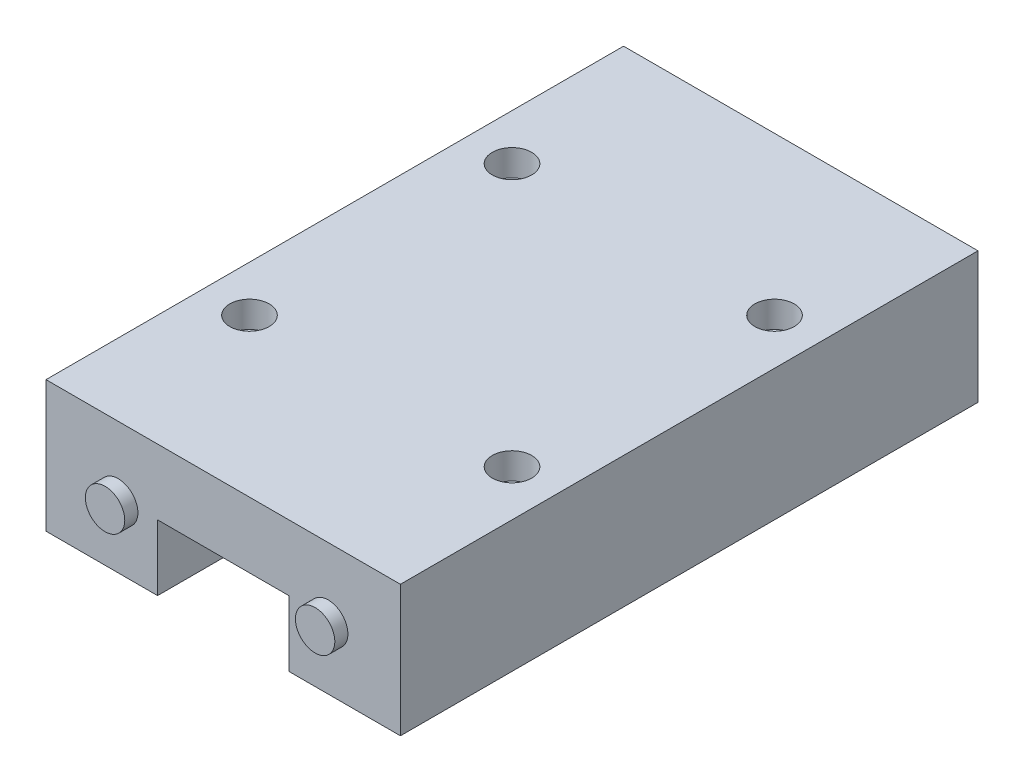
ISO-10303-21;
HEADER;
FILE_DESCRIPTION(('STEP AP214'),'2;1');
FILE_NAME('part.step','',(''),(''),'','','');
FILE_SCHEMA(('AUTOMOTIVE_DESIGN { 1 0 10303 214 1 1 1 1 }'));
ENDSEC;
DATA;
#1=APPLICATION_CONTEXT('core data for automotive mechanical design processes');
#2=APPLICATION_PROTOCOL_DEFINITION('international standard','automotive_design',2000,#1);
#3=PRODUCT_CONTEXT('',#1,'mechanical');
#4=PRODUCT('Part','Part','',(#3));
#5=PRODUCT_RELATED_PRODUCT_CATEGORY('part','',(#4));
#6=PRODUCT_DEFINITION_FORMATION('','',#4);
#7=PRODUCT_DEFINITION_CONTEXT('part definition',#1,'design');
#8=PRODUCT_DEFINITION('design','',#6,#7);
#9=PRODUCT_DEFINITION_SHAPE('','',#8);
#10=(LENGTH_UNIT() NAMED_UNIT(*) SI_UNIT(.MILLI.,.METRE.));
#11=(NAMED_UNIT(*) PLANE_ANGLE_UNIT() SI_UNIT($,.RADIAN.));
#12=(NAMED_UNIT(*) SI_UNIT($,.STERADIAN.) SOLID_ANGLE_UNIT());
#13=UNCERTAINTY_MEASURE_WITH_UNIT(LENGTH_MEASURE(1.E-05),#10,'distance_accuracy_value','');
#14=(GEOMETRIC_REPRESENTATION_CONTEXT(3) GLOBAL_UNCERTAINTY_ASSIGNED_CONTEXT((#13)) GLOBAL_UNIT_ASSIGNED_CONTEXT((#10,
#11,#12)) REPRESENTATION_CONTEXT('',''));
#15=CARTESIAN_POINT('',(0.,0.,0.));
#16=DIRECTION('',(0.,0.,1.));
#17=DIRECTION('',(1.,0.,0.));
#18=AXIS2_PLACEMENT_3D('',#15,#16,#17);
#19=CARTESIAN_POINT('',(-13.5,5.,44.));
#20=DIRECTION('',(1.,0.,0.));
#21=DIRECTION('',(0.,0.,-1.));
#22=AXIS2_PLACEMENT_3D('',#19,#20,#21);
#23=PLANE('',#22);
#24=DIRECTION('',(0.,-1.,0.));
#25=VECTOR('',#24,1.);
#26=CARTESIAN_POINT('',(-13.5,5.,0.));
#27=LINE('',#26,#25);
#28=CARTESIAN_POINT('',(-13.5,5.,0.));
#29=VERTEX_POINT('',#28);
#30=CARTESIAN_POINT('',(-13.5,-5.,0.));
#31=VERTEX_POINT('',#30);
#32=EDGE_CURVE('E130',#29,#31,#27,.T.);
#33=ORIENTED_EDGE('',*,*,#32,.T.);
#34=DIRECTION('',(0.,0.,-1.));
#35=VECTOR('',#34,1.);
#36=CARTESIAN_POINT('',(-13.5,-5.,44.));
#37=LINE('',#36,#35);
#38=CARTESIAN_POINT('',(-13.5,-5.,44.));
#39=VERTEX_POINT('',#38);
#40=EDGE_CURVE('E158',#39,#31,#37,.T.);
#41=ORIENTED_EDGE('',*,*,#40,.F.);
#42=DIRECTION('',(0.,-1.,0.));
#43=VECTOR('',#42,1.);
#44=CARTESIAN_POINT('',(-13.5,5.,44.));
#45=LINE('',#44,#43);
#46=CARTESIAN_POINT('',(-13.5,5.,44.));
#47=VERTEX_POINT('',#46);
#48=EDGE_CURVE('E145',#47,#39,#45,.T.);
#49=ORIENTED_EDGE('',*,*,#48,.F.);
#50=DIRECTION('',(0.,0.,-1.));
#51=VECTOR('',#50,1.);
#52=CARTESIAN_POINT('',(-13.5,5.,44.));
#53=LINE('',#52,#51);
#54=EDGE_CURVE('E126',#47,#29,#53,.T.);
#55=ORIENTED_EDGE('',*,*,#54,.T.);
#56=EDGE_LOOP('',(#33,#41,#49,#55));
#57=FACE_BOUND('',#56,.T.);
#58=ADVANCED_FACE('F33',(#57),#23,.F.);
#59=CARTESIAN_POINT('',(-13.5,-5.,44.));
#60=DIRECTION('',(0.,1.,0.));
#61=DIRECTION('',(0.,0.,1.));
#62=AXIS2_PLACEMENT_3D('',#59,#60,#61);
#63=PLANE('',#62);
#64=DIRECTION('',(1.,0.,0.));
#65=VECTOR('',#64,1.);
#66=CARTESIAN_POINT('',(-13.5,-5.,0.));
#67=LINE('',#66,#65);
#68=CARTESIAN_POINT('',(-5.,-5.,0.));
#69=VERTEX_POINT('',#68);
#70=EDGE_CURVE('E133',#31,#69,#67,.T.);
#71=ORIENTED_EDGE('',*,*,#70,.T.);
#72=DIRECTION('',(0.,0.,-1.));
#73=VECTOR('',#72,1.);
#74=CARTESIAN_POINT('',(-5.,-5.,44.));
#75=LINE('',#74,#73);
#76=CARTESIAN_POINT('',(-5.,-5.,44.));
#77=VERTEX_POINT('',#76);
#78=EDGE_CURVE('E155',#77,#69,#75,.T.);
#79=ORIENTED_EDGE('',*,*,#78,.F.);
#80=DIRECTION('',(1.,0.,0.));
#81=VECTOR('',#80,1.);
#82=CARTESIAN_POINT('',(-13.5,-5.,44.));
#83=LINE('',#82,#81);
#84=EDGE_CURVE('E93',#39,#77,#83,.T.);
#85=ORIENTED_EDGE('',*,*,#84,.F.);
#86=ORIENTED_EDGE('',*,*,#40,.T.);
#87=EDGE_LOOP('',(#71,#79,#85,#86));
#88=FACE_BOUND('',#87,.T.);
#89=ADVANCED_FACE('F190',(#88),#63,.F.);
#90=CARTESIAN_POINT('',(-5.,-5.,44.));
#91=DIRECTION('',(-1.,0.,0.));
#92=DIRECTION('',(0.,0.,1.));
#93=AXIS2_PLACEMENT_3D('',#90,#91,#92);
#94=PLANE('',#93);
#95=DIRECTION('',(0.,1.,0.));
#96=VECTOR('',#95,1.);
#97=CARTESIAN_POINT('',(-5.,-5.,0.));
#98=LINE('',#97,#96);
#99=CARTESIAN_POINT('',(-5.,0.,0.));
#100=VERTEX_POINT('',#99);
#101=EDGE_CURVE('E136',#69,#100,#98,.T.);
#102=ORIENTED_EDGE('',*,*,#101,.T.);
#103=DIRECTION('',(0.,0.,-1.));
#104=VECTOR('',#103,1.);
#105=CARTESIAN_POINT('',(-5.,0.,44.));
#106=LINE('',#105,#104);
#107=CARTESIAN_POINT('',(-5.,0.,44.));
#108=VERTEX_POINT('',#107);
#109=EDGE_CURVE('E152',#108,#100,#106,.T.);
#110=ORIENTED_EDGE('',*,*,#109,.F.);
#111=DIRECTION('',(0.,1.,0.));
#112=VECTOR('',#111,1.);
#113=CARTESIAN_POINT('',(-5.,-5.,44.));
#114=LINE('',#113,#112);
#115=EDGE_CURVE('E436',#77,#108,#114,.T.);
#116=ORIENTED_EDGE('',*,*,#115,.F.);
#117=ORIENTED_EDGE('',*,*,#78,.T.);
#118=EDGE_LOOP('',(#102,#110,#116,#117));
#119=FACE_BOUND('',#118,.T.);
#120=ADVANCED_FACE('F194',(#119),#94,.F.);
#121=CARTESIAN_POINT('',(-5.,0.,44.));
#122=DIRECTION('',(0.,1.,0.));
#123=DIRECTION('',(0.,0.,1.));
#124=AXIS2_PLACEMENT_3D('',#121,#122,#123);
#125=PLANE('',#124);
#126=DIRECTION('',(1.,0.,0.));
#127=VECTOR('',#126,1.);
#128=CARTESIAN_POINT('',(-5.,0.,0.));
#129=LINE('',#128,#127);
#130=CARTESIAN_POINT('',(5.,0.,0.));
#131=VERTEX_POINT('',#130);
#132=EDGE_CURVE('E138',#100,#131,#129,.T.);
#133=ORIENTED_EDGE('',*,*,#132,.T.);
#134=DIRECTION('',(0.,0.,-1.));
#135=VECTOR('',#134,1.);
#136=CARTESIAN_POINT('',(5.,0.,44.));
#137=LINE('',#136,#135);
#138=CARTESIAN_POINT('',(5.,0.,44.));
#139=VERTEX_POINT('',#138);
#140=EDGE_CURVE('E149',#139,#131,#137,.T.);
#141=ORIENTED_EDGE('',*,*,#140,.F.);
#142=DIRECTION('',(1.,0.,0.));
#143=VECTOR('',#142,1.);
#144=CARTESIAN_POINT('',(-5.,0.,44.));
#145=LINE('',#144,#143);
#146=EDGE_CURVE('E438',#108,#139,#145,.T.);
#147=ORIENTED_EDGE('',*,*,#146,.F.);
#148=ORIENTED_EDGE('',*,*,#109,.T.);
#149=EDGE_LOOP('',(#133,#141,#147,#148));
#150=FACE_BOUND('',#149,.T.);
#151=ADVANCED_FACE('F198',(#150),#125,.F.);
#152=CARTESIAN_POINT('',(5.,-5.,44.));
#153=DIRECTION('',(1.,0.,0.));
#154=DIRECTION('',(0.,0.,-1.));
#155=AXIS2_PLACEMENT_3D('',#152,#153,#154);
#156=PLANE('',#155);
#157=DIRECTION('',(0.,-1.,0.));
#158=VECTOR('',#157,1.);
#159=CARTESIAN_POINT('',(5.,-5.,0.));
#160=LINE('',#159,#158);
#161=CARTESIAN_POINT('',(5.,-5.,0.));
#162=VERTEX_POINT('',#161);
#163=EDGE_CURVE('E140',#131,#162,#160,.T.);
#164=ORIENTED_EDGE('',*,*,#163,.T.);
#165=DIRECTION('',(0.,0.,-1.));
#166=VECTOR('',#165,1.);
#167=CARTESIAN_POINT('',(5.,-5.,44.));
#168=LINE('',#167,#166);
#169=CARTESIAN_POINT('',(5.,-5.,44.));
#170=VERTEX_POINT('',#169);
#171=EDGE_CURVE('E121',#170,#162,#168,.T.);
#172=ORIENTED_EDGE('',*,*,#171,.F.);
#173=DIRECTION('',(0.,-1.,0.));
#174=VECTOR('',#173,1.);
#175=CARTESIAN_POINT('',(5.,-5.,44.));
#176=LINE('',#175,#174);
#177=EDGE_CURVE('E112',#139,#170,#176,.T.);
#178=ORIENTED_EDGE('',*,*,#177,.F.);
#179=ORIENTED_EDGE('',*,*,#140,.T.);
#180=EDGE_LOOP('',(#164,#172,#178,#179));
#181=FACE_BOUND('',#180,.T.);
#182=ADVANCED_FACE('F204',(#181),#156,.F.);
#183=CARTESIAN_POINT('',(5.,-5.,44.));
#184=DIRECTION('',(0.,1.,0.));
#185=DIRECTION('',(-1.,0.,0.));
#186=AXIS2_PLACEMENT_3D('',#183,#184,#185);
#187=PLANE('',#186);
#188=DIRECTION('',(1.,0.,0.));
#189=VECTOR('',#188,1.);
#190=CARTESIAN_POINT('',(5.,-5.,0.));
#191=LINE('',#190,#189);
#192=CARTESIAN_POINT('',(13.5,-5.,0.));
#193=VERTEX_POINT('',#192);
#194=EDGE_CURVE('E120',#162,#193,#191,.T.);
#195=ORIENTED_EDGE('',*,*,#194,.T.);
#196=DIRECTION('',(0.,0.,-1.));
#197=VECTOR('',#196,1.);
#198=CARTESIAN_POINT('',(13.5,-5.,44.));
#199=LINE('',#198,#197);
#200=CARTESIAN_POINT('',(13.5,-5.,44.));
#201=VERTEX_POINT('',#200);
#202=EDGE_CURVE('E117',#201,#193,#199,.T.);
#203=ORIENTED_EDGE('',*,*,#202,.F.);
#204=DIRECTION('',(1.,0.,0.));
#205=VECTOR('',#204,1.);
#206=CARTESIAN_POINT('',(5.,-5.,44.));
#207=LINE('',#206,#205);
#208=EDGE_CURVE('E106',#170,#201,#207,.T.);
#209=ORIENTED_EDGE('',*,*,#208,.F.);
#210=ORIENTED_EDGE('',*,*,#171,.T.);
#211=EDGE_LOOP('',(#195,#203,#209,#210));
#212=FACE_BOUND('',#211,.T.);
#213=ADVANCED_FACE('F118',(#212),#187,.F.);
#214=CARTESIAN_POINT('',(13.5,5.,44.));
#215=DIRECTION('',(-1.,0.,0.));
#216=DIRECTION('',(0.,0.,1.));
#217=AXIS2_PLACEMENT_3D('',#214,#215,#216);
#218=PLANE('',#217);
#219=DIRECTION('',(0.,1.,0.));
#220=VECTOR('',#219,1.);
#221=CARTESIAN_POINT('',(13.5,5.,0.));
#222=LINE('',#221,#220);
#223=CARTESIAN_POINT('',(13.5,5.,0.));
#224=VERTEX_POINT('',#223);
#225=EDGE_CURVE('E78',#193,#224,#222,.T.);
#226=ORIENTED_EDGE('',*,*,#225,.T.);
#227=DIRECTION('',(0.,0.,-1.));
#228=VECTOR('',#227,1.);
#229=CARTESIAN_POINT('',(13.5,5.,44.));
#230=LINE('',#229,#228);
#231=CARTESIAN_POINT('',(13.5,5.,44.));
#232=VERTEX_POINT('',#231);
#233=EDGE_CURVE('E122',#232,#224,#230,.T.);
#234=ORIENTED_EDGE('',*,*,#233,.F.);
#235=DIRECTION('',(0.,1.,0.));
#236=VECTOR('',#235,1.);
#237=CARTESIAN_POINT('',(13.5,5.,44.));
#238=LINE('',#237,#236);
#239=EDGE_CURVE('E110',#201,#232,#238,.T.);
#240=ORIENTED_EDGE('',*,*,#239,.F.);
#241=ORIENTED_EDGE('',*,*,#202,.T.);
#242=EDGE_LOOP('',(#226,#234,#240,#241));
#243=FACE_BOUND('',#242,.T.);
#244=ADVANCED_FACE('F124',(#243),#218,.F.);
#245=CARTESIAN_POINT('',(-13.5,5.,44.));
#246=DIRECTION('',(0.,-1.,0.));
#247=DIRECTION('',(0.,0.,-1.));
#248=AXIS2_PLACEMENT_3D('',#245,#246,#247);
#249=PLANE('',#248);
#250=CARTESIAN_POINT('',(10.,5.,32.));
#251=DIRECTION('',(0.,1.,0.));
#252=DIRECTION('',(0.,0.,-1.));
#253=AXIS2_PLACEMENT_3D('',#250,#251,#252);
#254=CIRCLE('',#253,1.5);
#255=CARTESIAN_POINT('',(10.,5.,30.5));
#256=VERTEX_POINT('',#255);
#257=EDGE_CURVE('E416',#256,#256,#254,.T.);
#258=ORIENTED_EDGE('',*,*,#257,.F.);
#259=EDGE_LOOP('',(#258));
#260=FACE_BOUND('',#259,.T.);
#261=CARTESIAN_POINT('',(10.,5.,12.));
#262=DIRECTION('',(0.,1.,0.));
#263=DIRECTION('',(0.,0.,1.));
#264=AXIS2_PLACEMENT_3D('',#261,#262,#263);
#265=CIRCLE('',#264,1.5);
#266=CARTESIAN_POINT('',(10.,5.,13.5));
#267=VERTEX_POINT('',#266);
#268=EDGE_CURVE('E422',#267,#267,#265,.T.);
#269=ORIENTED_EDGE('',*,*,#268,.F.);
#270=EDGE_LOOP('',(#269));
#271=FACE_BOUND('',#270,.T.);
#272=CARTESIAN_POINT('',(-10.,5.,12.));
#273=DIRECTION('',(0.,1.,0.));
#274=DIRECTION('',(0.,0.,-1.));
#275=AXIS2_PLACEMENT_3D('',#272,#273,#274);
#276=CIRCLE('',#275,1.5);
#277=CARTESIAN_POINT('',(-10.,5.,10.5));
#278=VERTEX_POINT('',#277);
#279=EDGE_CURVE('E409',#278,#278,#276,.T.);
#280=ORIENTED_EDGE('',*,*,#279,.F.);
#281=EDGE_LOOP('',(#280));
#282=FACE_BOUND('',#281,.T.);
#283=CARTESIAN_POINT('',(-10.,5.,32.));
#284=DIRECTION('',(0.,1.,0.));
#285=DIRECTION('',(0.,0.,1.));
#286=AXIS2_PLACEMENT_3D('',#283,#284,#285);
#287=CIRCLE('',#286,1.5);
#288=CARTESIAN_POINT('',(-10.,5.,33.5));
#289=VERTEX_POINT('',#288);
#290=EDGE_CURVE('E415',#289,#289,#287,.T.);
#291=ORIENTED_EDGE('',*,*,#290,.F.);
#292=EDGE_LOOP('',(#291));
#293=FACE_BOUND('',#292,.T.);
#294=DIRECTION('',(-1.,0.,0.));
#295=VECTOR('',#294,1.);
#296=CARTESIAN_POINT('',(-13.5,5.,0.));
#297=LINE('',#296,#295);
#298=EDGE_CURVE('E84',#224,#29,#297,.T.);
#299=ORIENTED_EDGE('',*,*,#298,.T.);
#300=ORIENTED_EDGE('',*,*,#54,.F.);
#301=DIRECTION('',(-1.,0.,0.));
#302=VECTOR('',#301,1.);
#303=CARTESIAN_POINT('',(-13.5,5.,44.));
#304=LINE('',#303,#302);
#305=EDGE_CURVE('E49',#232,#47,#304,.T.);
#306=ORIENTED_EDGE('',*,*,#305,.F.);
#307=ORIENTED_EDGE('',*,*,#233,.T.);
#308=EDGE_LOOP('',(#299,#300,#306,#307));
#309=FACE_BOUND('',#308,.T.);
#310=ADVANCED_FACE('F175',(#260,#271,#282,#293,#309),#249,.F.);
#311=CARTESIAN_POINT('',(0.,0.,44.));
#312=DIRECTION('',(0.,0.,1.));
#313=DIRECTION('',(1.,0.,0.));
#314=AXIS2_PLACEMENT_3D('',#311,#312,#313);
#315=PLANE('',#314);
#316=CARTESIAN_POINT('',(8.,-0.284098190144481,44.));
#317=DIRECTION('',(0.,0.,1.));
#318=DIRECTION('',(-1.,0.,0.));
#319=AXIS2_PLACEMENT_3D('',#316,#317,#318);
#320=CIRCLE('',#319,1.5);
#321=CARTESIAN_POINT('',(6.5,-0.284098190144481,44.));
#322=VERTEX_POINT('',#321);
#323=EDGE_CURVE('E397',#322,#322,#320,.T.);
#324=ORIENTED_EDGE('',*,*,#323,.F.);
#325=EDGE_LOOP('',(#324));
#326=FACE_BOUND('',#325,.T.);
#327=CARTESIAN_POINT('',(-8.,-0.284098190144481,44.));
#328=DIRECTION('',(0.,0.,1.));
#329=DIRECTION('',(1.,0.,0.));
#330=AXIS2_PLACEMENT_3D('',#327,#328,#329);
#331=CIRCLE('',#330,1.5);
#332=CARTESIAN_POINT('',(-6.5,-0.284098190144481,44.));
#333=VERTEX_POINT('',#332);
#334=EDGE_CURVE('E403',#333,#333,#331,.T.);
#335=ORIENTED_EDGE('',*,*,#334,.F.);
#336=EDGE_LOOP('',(#335));
#337=FACE_BOUND('',#336,.T.);
#338=ORIENTED_EDGE('',*,*,#48,.T.);
#339=ORIENTED_EDGE('',*,*,#84,.T.);
#340=ORIENTED_EDGE('',*,*,#115,.T.);
#341=ORIENTED_EDGE('',*,*,#146,.T.);
#342=ORIENTED_EDGE('',*,*,#177,.T.);
#343=ORIENTED_EDGE('',*,*,#208,.T.);
#344=ORIENTED_EDGE('',*,*,#239,.T.);
#345=ORIENTED_EDGE('',*,*,#305,.T.);
#346=EDGE_LOOP('',(#338,#339,#340,#341,#342,#343,#344,#345));
#347=FACE_BOUND('',#346,.T.);
#348=ADVANCED_FACE('F108',(#326,#337,#347),#315,.T.);
#349=CARTESIAN_POINT('',(0.,0.,0.));
#350=DIRECTION('',(0.,0.,1.));
#351=DIRECTION('',(1.,0.,0.));
#352=AXIS2_PLACEMENT_3D('',#349,#350,#351);
#353=PLANE('',#352);
#354=CARTESIAN_POINT('',(-8.,0.,0.));
#355=DIRECTION('',(0.,0.,1.));
#356=DIRECTION('',(1.,0.,0.));
#357=AXIS2_PLACEMENT_3D('',#354,#355,#356);
#358=CIRCLE('',#357,1.5);
#359=CARTESIAN_POINT('',(-6.5,0.,0.));
#360=VERTEX_POINT('',#359);
#361=EDGE_CURVE('E11',#360,#360,#358,.F.);
#362=ORIENTED_EDGE('',*,*,#361,.F.);
#363=EDGE_LOOP('',(#362));
#364=FACE_BOUND('',#363,.T.);
#365=CARTESIAN_POINT('',(8.,0.,0.));
#366=DIRECTION('',(0.,0.,1.));
#367=DIRECTION('',(1.,0.,0.));
#368=AXIS2_PLACEMENT_3D('',#365,#366,#367);
#369=CIRCLE('',#368,1.5);
#370=CARTESIAN_POINT('',(9.5,0.,0.));
#371=VERTEX_POINT('',#370);
#372=EDGE_CURVE('E41',#371,#371,#369,.F.);
#373=ORIENTED_EDGE('',*,*,#372,.F.);
#374=EDGE_LOOP('',(#373));
#375=FACE_BOUND('',#374,.T.);
#376=ORIENTED_EDGE('',*,*,#32,.F.);
#377=ORIENTED_EDGE('',*,*,#298,.F.);
#378=ORIENTED_EDGE('',*,*,#225,.F.);
#379=ORIENTED_EDGE('',*,*,#194,.F.);
#380=ORIENTED_EDGE('',*,*,#163,.F.);
#381=ORIENTED_EDGE('',*,*,#132,.F.);
#382=ORIENTED_EDGE('',*,*,#101,.F.);
#383=ORIENTED_EDGE('',*,*,#70,.F.);
#384=EDGE_LOOP('',(#376,#377,#378,#379,#380,#381,#382,#383));
#385=FACE_BOUND('',#384,.T.);
#386=ADVANCED_FACE('F164',(#364,#375,#385),#353,.F.);
#387=CARTESIAN_POINT('',(-10.,3.,32.));
#388=DIRECTION('',(0.,1.,0.));
#389=DIRECTION('',(0.,0.,1.));
#390=AXIS2_PLACEMENT_3D('',#387,#388,#389);
#391=CYLINDRICAL_SURFACE('',#390,1.5);
#392=CARTESIAN_POINT('',(-10.,3.,32.));
#393=DIRECTION('',(0.,1.,0.));
#394=DIRECTION('',(0.,0.,1.));
#395=AXIS2_PLACEMENT_3D('',#392,#393,#394);
#396=CIRCLE('',#395,1.5);
#397=CARTESIAN_POINT('',(-10.,3.,33.5));
#398=VERTEX_POINT('',#397);
#399=EDGE_CURVE('E134',#398,#398,#396,.T.);
#400=ORIENTED_EDGE('',*,*,#399,.F.);
#401=EDGE_LOOP('',(#400));
#402=FACE_BOUND('',#401,.T.);
#403=ORIENTED_EDGE('',*,*,#290,.T.);
#404=EDGE_LOOP('',(#403));
#405=FACE_BOUND('',#404,.T.);
#406=ADVANCED_FACE('F167',(#402,#405),#391,.F.);
#407=CARTESIAN_POINT('',(-10.,3.,32.));
#408=DIRECTION('',(0.,1.,0.));
#409=DIRECTION('',(0.,0.,1.));
#410=AXIS2_PLACEMENT_3D('',#407,#408,#409);
#411=PLANE('',#410);
#412=ORIENTED_EDGE('',*,*,#399,.T.);
#413=EDGE_LOOP('',(#412));
#414=FACE_BOUND('',#413,.T.);
#415=ADVANCED_FACE('F232',(#414),#411,.T.);
#416=CARTESIAN_POINT('',(-10.,3.,12.));
#417=DIRECTION('',(0.,1.,0.));
#418=DIRECTION('',(0.,0.,1.));
#419=AXIS2_PLACEMENT_3D('',#416,#417,#418);
#420=CYLINDRICAL_SURFACE('',#419,1.5);
#421=CARTESIAN_POINT('',(-10.,3.,12.));
#422=DIRECTION('',(0.,1.,0.));
#423=DIRECTION('',(0.,0.,-1.));
#424=AXIS2_PLACEMENT_3D('',#421,#422,#423);
#425=CIRCLE('',#424,1.5);
#426=CARTESIAN_POINT('',(-10.,3.,10.5));
#427=VERTEX_POINT('',#426);
#428=EDGE_CURVE('E425',#427,#427,#425,.T.);
#429=ORIENTED_EDGE('',*,*,#428,.F.);
#430=EDGE_LOOP('',(#429));
#431=FACE_BOUND('',#430,.T.);
#432=ORIENTED_EDGE('',*,*,#279,.T.);
#433=EDGE_LOOP('',(#432));
#434=FACE_BOUND('',#433,.T.);
#435=ADVANCED_FACE('F244',(#431,#434),#420,.F.);
#436=CARTESIAN_POINT('',(-10.,3.,12.));
#437=DIRECTION('',(0.,-1.,0.));
#438=DIRECTION('',(0.,0.,-1.));
#439=AXIS2_PLACEMENT_3D('',#436,#437,#438);
#440=PLANE('',#439);
#441=ORIENTED_EDGE('',*,*,#428,.T.);
#442=EDGE_LOOP('',(#441));
#443=FACE_BOUND('',#442,.T.);
#444=ADVANCED_FACE('F254',(#443),#440,.F.);
#445=CARTESIAN_POINT('',(10.,3.,12.));
#446=DIRECTION('',(0.,1.,0.));
#447=DIRECTION('',(0.,0.,1.));
#448=AXIS2_PLACEMENT_3D('',#445,#446,#447);
#449=CYLINDRICAL_SURFACE('',#448,1.5);
#450=CARTESIAN_POINT('',(10.,3.,12.));
#451=DIRECTION('',(0.,1.,0.));
#452=DIRECTION('',(0.,0.,1.));
#453=AXIS2_PLACEMENT_3D('',#450,#451,#452);
#454=CIRCLE('',#453,1.5);
#455=CARTESIAN_POINT('',(10.,3.,13.5));
#456=VERTEX_POINT('',#455);
#457=EDGE_CURVE('E419',#456,#456,#454,.T.);
#458=ORIENTED_EDGE('',*,*,#457,.F.);
#459=EDGE_LOOP('',(#458));
#460=FACE_BOUND('',#459,.T.);
#461=ORIENTED_EDGE('',*,*,#268,.T.);
#462=EDGE_LOOP('',(#461));
#463=FACE_BOUND('',#462,.T.);
#464=ADVANCED_FACE('F264',(#460,#463),#449,.F.);
#465=CARTESIAN_POINT('',(10.,3.,12.));
#466=DIRECTION('',(0.,1.,0.));
#467=DIRECTION('',(0.,0.,1.));
#468=AXIS2_PLACEMENT_3D('',#465,#466,#467);
#469=PLANE('',#468);
#470=ORIENTED_EDGE('',*,*,#457,.T.);
#471=EDGE_LOOP('',(#470));
#472=FACE_BOUND('',#471,.T.);
#473=ADVANCED_FACE('F274',(#472),#469,.T.);
#474=CARTESIAN_POINT('',(10.,3.,32.));
#475=DIRECTION('',(0.,1.,0.));
#476=DIRECTION('',(0.,0.,1.));
#477=AXIS2_PLACEMENT_3D('',#474,#475,#476);
#478=CYLINDRICAL_SURFACE('',#477,1.5);
#479=CARTESIAN_POINT('',(10.,3.,32.));
#480=DIRECTION('',(0.,1.,0.));
#481=DIRECTION('',(0.,0.,-1.));
#482=AXIS2_PLACEMENT_3D('',#479,#480,#481);
#483=CIRCLE('',#482,1.5);
#484=CARTESIAN_POINT('',(10.,3.,30.5));
#485=VERTEX_POINT('',#484);
#486=EDGE_CURVE('E412',#485,#485,#483,.T.);
#487=ORIENTED_EDGE('',*,*,#486,.F.);
#488=EDGE_LOOP('',(#487));
#489=FACE_BOUND('',#488,.T.);
#490=ORIENTED_EDGE('',*,*,#257,.T.);
#491=EDGE_LOOP('',(#490));
#492=FACE_BOUND('',#491,.T.);
#493=ADVANCED_FACE('F284',(#489,#492),#478,.F.);
#494=CARTESIAN_POINT('',(10.,3.,32.));
#495=DIRECTION('',(0.,-1.,0.));
#496=DIRECTION('',(0.,0.,-1.));
#497=AXIS2_PLACEMENT_3D('',#494,#495,#496);
#498=PLANE('',#497);
#499=ORIENTED_EDGE('',*,*,#486,.T.);
#500=EDGE_LOOP('',(#499));
#501=FACE_BOUND('',#500,.T.);
#502=ADVANCED_FACE('F294',(#501),#498,.F.);
#503=CARTESIAN_POINT('',(-8.,-0.284098190144481,45.));
#504=DIRECTION('',(0.,0.,-1.));
#505=DIRECTION('',(-1.,0.,0.));
#506=AXIS2_PLACEMENT_3D('',#503,#504,#505);
#507=CYLINDRICAL_SURFACE('',#506,1.5);
#508=CARTESIAN_POINT('',(-8.,-0.284098190144481,45.));
#509=DIRECTION('',(0.,0.,1.));
#510=DIRECTION('',(1.,0.,0.));
#511=AXIS2_PLACEMENT_3D('',#508,#509,#510);
#512=CIRCLE('',#511,1.5);
#513=CARTESIAN_POINT('',(-6.5,-0.284098190144481,45.));
#514=VERTEX_POINT('',#513);
#515=EDGE_CURVE('E406',#514,#514,#512,.T.);
#516=ORIENTED_EDGE('',*,*,#515,.F.);
#517=EDGE_LOOP('',(#516));
#518=FACE_BOUND('',#517,.T.);
#519=ORIENTED_EDGE('',*,*,#334,.T.);
#520=EDGE_LOOP('',(#519));
#521=FACE_BOUND('',#520,.T.);
#522=ADVANCED_FACE('F303',(#518,#521),#507,.T.);
#523=CARTESIAN_POINT('',(-8.,-0.284098190144481,45.));
#524=DIRECTION('',(0.,0.,1.));
#525=DIRECTION('',(1.,0.,0.));
#526=AXIS2_PLACEMENT_3D('',#523,#524,#525);
#527=PLANE('',#526);
#528=ORIENTED_EDGE('',*,*,#515,.T.);
#529=EDGE_LOOP('',(#528));
#530=FACE_BOUND('',#529,.T.);
#531=ADVANCED_FACE('F316',(#530),#527,.T.);
#532=CARTESIAN_POINT('',(8.,-0.284098190144481,45.));
#533=DIRECTION('',(0.,0.,-1.));
#534=DIRECTION('',(-1.,0.,0.));
#535=AXIS2_PLACEMENT_3D('',#532,#533,#534);
#536=CYLINDRICAL_SURFACE('',#535,1.5);
#537=CARTESIAN_POINT('',(8.,-0.284098190144481,45.));
#538=DIRECTION('',(0.,0.,1.));
#539=DIRECTION('',(-1.,0.,0.));
#540=AXIS2_PLACEMENT_3D('',#537,#538,#539);
#541=CIRCLE('',#540,1.5);
#542=CARTESIAN_POINT('',(6.5,-0.284098190144481,45.));
#543=VERTEX_POINT('',#542);
#544=EDGE_CURVE('E400',#543,#543,#541,.T.);
#545=ORIENTED_EDGE('',*,*,#544,.F.);
#546=EDGE_LOOP('',(#545));
#547=FACE_BOUND('',#546,.T.);
#548=ORIENTED_EDGE('',*,*,#323,.T.);
#549=EDGE_LOOP('',(#548));
#550=FACE_BOUND('',#549,.T.);
#551=ADVANCED_FACE('F326',(#547,#550),#536,.T.);
#552=CARTESIAN_POINT('',(8.,-0.284098190144481,45.));
#553=DIRECTION('',(0.,0.,-1.));
#554=DIRECTION('',(-1.,0.,0.));
#555=AXIS2_PLACEMENT_3D('',#552,#553,#554);
#556=PLANE('',#555);
#557=ORIENTED_EDGE('',*,*,#544,.T.);
#558=EDGE_LOOP('',(#557));
#559=FACE_BOUND('',#558,.T.);
#560=ADVANCED_FACE('F336',(#559),#556,.F.);
#561=CARTESIAN_POINT('',(8.,0.,-1.));
#562=DIRECTION('',(0.,0.,1.));
#563=DIRECTION('',(1.,0.,0.));
#564=AXIS2_PLACEMENT_3D('',#561,#562,#563);
#565=CYLINDRICAL_SURFACE('',#564,1.5);
#566=CARTESIAN_POINT('',(8.,0.,-1.));
#567=DIRECTION('',(0.,0.,-1.));
#568=DIRECTION('',(-1.,0.,0.));
#569=AXIS2_PLACEMENT_3D('',#566,#567,#568);
#570=CIRCLE('',#569,1.5);
#571=CARTESIAN_POINT('',(6.5,0.,-1.));
#572=VERTEX_POINT('',#571);
#573=EDGE_CURVE('E394',#572,#572,#570,.T.);
#574=ORIENTED_EDGE('',*,*,#573,.F.);
#575=EDGE_LOOP('',(#574));
#576=FACE_BOUND('',#575,.T.);
#577=ORIENTED_EDGE('',*,*,#372,.T.);
#578=EDGE_LOOP('',(#577));
#579=FACE_BOUND('',#578,.T.);
#580=ADVANCED_FACE('F162',(#576,#579),#565,.T.);
#581=CARTESIAN_POINT('',(8.,0.,-1.));
#582=DIRECTION('',(0.,0.,-1.));
#583=DIRECTION('',(-1.,0.,0.));
#584=AXIS2_PLACEMENT_3D('',#581,#582,#583);
#585=PLANE('',#584);
#586=ORIENTED_EDGE('',*,*,#573,.T.);
#587=EDGE_LOOP('',(#586));
#588=FACE_BOUND('',#587,.T.);
#589=ADVANCED_FACE('F357',(#588),#585,.T.);
#590=CARTESIAN_POINT('',(-8.,0.,-1.));
#591=DIRECTION('',(0.,0.,1.));
#592=DIRECTION('',(1.,0.,0.));
#593=AXIS2_PLACEMENT_3D('',#590,#591,#592);
#594=CYLINDRICAL_SURFACE('',#593,1.5);
#595=CARTESIAN_POINT('',(-8.,0.,-1.));
#596=DIRECTION('',(0.,0.,-1.));
#597=DIRECTION('',(1.,0.,0.));
#598=AXIS2_PLACEMENT_3D('',#595,#596,#597);
#599=CIRCLE('',#598,1.5);
#600=CARTESIAN_POINT('',(-6.5,0.,-1.));
#601=VERTEX_POINT('',#600);
#602=EDGE_CURVE('E393',#601,#601,#599,.T.);
#603=ORIENTED_EDGE('',*,*,#602,.F.);
#604=EDGE_LOOP('',(#603));
#605=FACE_BOUND('',#604,.T.);
#606=ORIENTED_EDGE('',*,*,#361,.T.);
#607=EDGE_LOOP('',(#606));
#608=FACE_BOUND('',#607,.T.);
#609=ADVANCED_FACE('F367',(#605,#608),#594,.T.);
#610=CARTESIAN_POINT('',(-8.,0.,-1.));
#611=DIRECTION('',(0.,0.,1.));
#612=DIRECTION('',(1.,0.,0.));
#613=AXIS2_PLACEMENT_3D('',#610,#611,#612);
#614=PLANE('',#613);
#615=ORIENTED_EDGE('',*,*,#602,.T.);
#616=EDGE_LOOP('',(#615));
#617=FACE_BOUND('',#616,.T.);
#618=ADVANCED_FACE('F377',(#617),#614,.F.);
#619=CLOSED_SHELL('',(#58,#89,#120,#151,#182,#213,#244,#310,#348,#386,#406,#415,#435,#444,#464,
#473,#493,#502,#522,#531,#551,#560,#580,#589,#609,#618));
#620=MANIFOLD_SOLID_BREP('B2',#619);
#621=ADVANCED_BREP_SHAPE_REPRESENTATION('',(#18,#620),#14);
#622=SHAPE_DEFINITION_REPRESENTATION(#9,#621);
ENDSEC;
END-ISO-10303-21;
